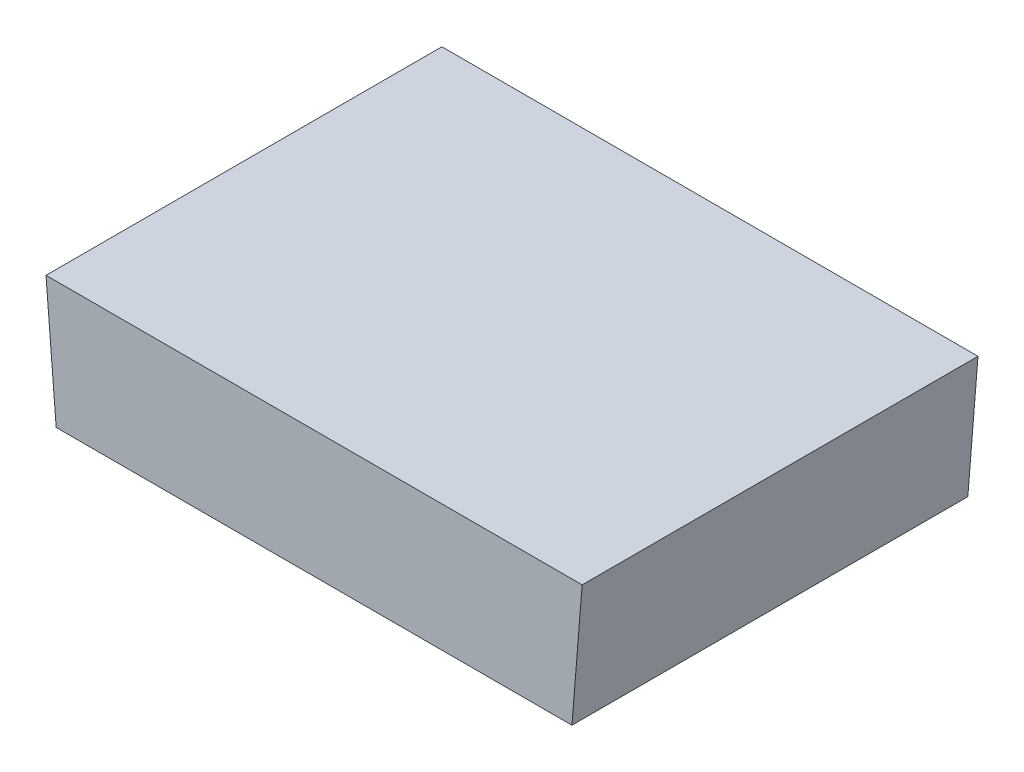
ISO-10303-21;
HEADER;
FILE_DESCRIPTION(('STEP AP214'),'2;1');
FILE_NAME('part.step','',(''),(''),'','','');
FILE_SCHEMA(('AUTOMOTIVE_DESIGN { 1 0 10303 214 1 1 1 1 }'));
ENDSEC;
DATA;
#1=APPLICATION_CONTEXT('core data for automotive mechanical design processes');
#2=APPLICATION_PROTOCOL_DEFINITION('international standard','automotive_design',2000,#1);
#3=PRODUCT_CONTEXT('',#1,'mechanical');
#4=PRODUCT('Part','Part','',(#3));
#5=PRODUCT_RELATED_PRODUCT_CATEGORY('part','',(#4));
#6=PRODUCT_DEFINITION_FORMATION('','',#4);
#7=PRODUCT_DEFINITION_CONTEXT('part definition',#1,'design');
#8=PRODUCT_DEFINITION('design','',#6,#7);
#9=PRODUCT_DEFINITION_SHAPE('','',#8);
#10=(LENGTH_UNIT() NAMED_UNIT(*) SI_UNIT(.MILLI.,.METRE.));
#11=(NAMED_UNIT(*) PLANE_ANGLE_UNIT() SI_UNIT($,.RADIAN.));
#12=(NAMED_UNIT(*) SI_UNIT($,.STERADIAN.) SOLID_ANGLE_UNIT());
#13=UNCERTAINTY_MEASURE_WITH_UNIT(LENGTH_MEASURE(1.E-05),#10,'distance_accuracy_value','');
#14=(GEOMETRIC_REPRESENTATION_CONTEXT(3) GLOBAL_UNCERTAINTY_ASSIGNED_CONTEXT((#13)) GLOBAL_UNIT_ASSIGNED_CONTEXT((#10,
#11,#12)) REPRESENTATION_CONTEXT('',''));
#15=CARTESIAN_POINT('',(0.,0.,0.));
#16=DIRECTION('',(0.,0.,1.));
#17=DIRECTION('',(1.,0.,0.));
#18=AXIS2_PLACEMENT_3D('',#15,#16,#17);
#19=CARTESIAN_POINT('',(45.24375,-11.9889788732394,69.453125));
#20=DIRECTION('',(0.,-1.,0.));
#21=DIRECTION('',(1.,0.,0.));
#22=AXIS2_PLACEMENT_3D('',#19,#20,#21);
#23=PLANE('',#22);
#24=CARTESIAN_POINT('',(36.01640625,-11.9889788732394,58.44778125));
#25=DIRECTION('',(0.,-1.,0.));
#26=DIRECTION('',(1.,0.,0.));
#27=AXIS2_PLACEMENT_3D('',#24,#25,#26);
#28=CIRCLE('',#27,6.05234374999999);
#29=CARTESIAN_POINT('',(42.06875,-11.9889788732394,58.44778125));
#30=VERTEX_POINT('',#29);
#31=EDGE_CURVE('E179',#30,#30,#28,.T.);
#32=ORIENTED_EDGE('',*,*,#31,.F.);
#33=EDGE_LOOP('',(#32));
#34=FACE_BOUND('',#33,.T.);
#35=CARTESIAN_POINT('',(-36.01640625,-11.9889788732394,57.24921875));
#36=DIRECTION('',(0.,-1.,0.));
#37=DIRECTION('',(1.,0.,0.));
#38=AXIS2_PLACEMENT_3D('',#35,#36,#37);
#39=CIRCLE('',#38,6.05234374999999);
#40=CARTESIAN_POINT('',(-29.9640625,-11.9889788732394,57.24921875));
#41=VERTEX_POINT('',#40);
#42=EDGE_CURVE('E183',#41,#41,#39,.T.);
#43=ORIENTED_EDGE('',*,*,#42,.F.);
#44=EDGE_LOOP('',(#43));
#45=FACE_BOUND('',#44,.T.);
#46=CARTESIAN_POINT('',(-36.01640625,-11.9889788732394,9.22734375));
#47=DIRECTION('',(0.,-1.,0.));
#48=DIRECTION('',(1.,0.,0.));
#49=AXIS2_PLACEMENT_3D('',#46,#47,#48);
#50=CIRCLE('',#49,6.05234375);
#51=CARTESIAN_POINT('',(-29.9640625,-11.9889788732394,9.22734375));
#52=VERTEX_POINT('',#51);
#53=EDGE_CURVE('E189',#52,#52,#50,.T.);
#54=ORIENTED_EDGE('',*,*,#53,.F.);
#55=EDGE_LOOP('',(#54));
#56=FACE_BOUND('',#55,.T.);
#57=CARTESIAN_POINT('',(36.01640625,-11.9889788732394,10.42590625));
#58=DIRECTION('',(0.,-1.,0.));
#59=DIRECTION('',(1.,0.,0.));
#60=AXIS2_PLACEMENT_3D('',#57,#58,#59);
#61=CIRCLE('',#60,6.05234375);
#62=CARTESIAN_POINT('',(42.06875,-11.9889788732394,10.42590625));
#63=VERTEX_POINT('',#62);
#64=EDGE_CURVE('E195',#63,#63,#61,.T.);
#65=ORIENTED_EDGE('',*,*,#64,.F.);
#66=EDGE_LOOP('',(#65));
#67=FACE_BOUND('',#66,.T.);
#68=DIRECTION('',(-1.,0.,0.));
#69=VECTOR('',#68,1.);
#70=CARTESIAN_POINT('',(45.24375,-11.9889788732394,0.));
#71=LINE('',#70,#69);
#72=CARTESIAN_POINT('',(45.24375,-11.9889788732394,0.));
#73=VERTEX_POINT('',#72);
#74=CARTESIAN_POINT('',(-45.24375,-11.9889788732394,0.));
#75=VERTEX_POINT('',#74);
#76=EDGE_CURVE('E208',#73,#75,#71,.T.);
#77=ORIENTED_EDGE('',*,*,#76,.F.);
#78=DIRECTION('',(0.,0.,-1.));
#79=VECTOR('',#78,1.);
#80=CARTESIAN_POINT('',(45.24375,-11.9889788732394,69.453125));
#81=LINE('',#80,#79);
#82=CARTESIAN_POINT('',(45.24375,-11.9889788732394,69.453125));
#83=VERTEX_POINT('',#82);
#84=EDGE_CURVE('E215',#83,#73,#81,.T.);
#85=ORIENTED_EDGE('',*,*,#84,.F.);
#86=DIRECTION('',(-1.,0.,0.));
#87=VECTOR('',#86,1.);
#88=CARTESIAN_POINT('',(45.24375,-11.9889788732394,69.453125));
#89=LINE('',#88,#87);
#90=CARTESIAN_POINT('',(-45.24375,-11.9889788732394,69.453125));
#91=VERTEX_POINT('',#90);
#92=EDGE_CURVE('E212',#83,#91,#89,.T.);
#93=ORIENTED_EDGE('',*,*,#92,.T.);
#94=DIRECTION('',(0.,0.,-1.));
#95=VECTOR('',#94,1.);
#96=CARTESIAN_POINT('',(-45.24375,-11.9889788732394,69.453125));
#97=LINE('',#96,#95);
#98=EDGE_CURVE('E226',#91,#75,#97,.T.);
#99=ORIENTED_EDGE('',*,*,#98,.T.);
#100=EDGE_LOOP('',(#77,#85,#93,#99));
#101=FACE_BOUND('',#100,.T.);
#102=DIRECTION('',(0.,0.,1.));
#103=VECTOR('',#102,1.);
#104=CARTESIAN_POINT('',(34.4110584654185,-11.9889788732394,33.4206221840761));
#105=LINE('',#104,#103);
#106=CARTESIAN_POINT('',(34.4110584654185,-11.9889788732394,33.4206221840761));
#107=VERTEX_POINT('',#106);
#108=CARTESIAN_POINT('',(34.4110584654185,-11.9889788732394,38.778434684076));
#109=VERTEX_POINT('',#108);
#110=EDGE_CURVE('E151',#107,#109,#105,.T.);
#111=ORIENTED_EDGE('',*,*,#110,.F.);
#112=CARTESIAN_POINT('',(29.1524647154185,-11.9889788732394,33.4206221840761));
#113=DIRECTION('',(0.,-1.,0.));
#114=DIRECTION('',(1.,0.,0.));
#115=AXIS2_PLACEMENT_3D('',#112,#113,#114);
#116=CIRCLE('',#115,5.25859375);
#117=CARTESIAN_POINT('',(23.8938709654185,-11.9889788732394,33.4206221840761));
#118=VERTEX_POINT('',#117);
#119=EDGE_CURVE('E148',#118,#107,#116,.T.);
#120=ORIENTED_EDGE('',*,*,#119,.F.);
#121=DIRECTION('',(0.,0.,-1.));
#122=VECTOR('',#121,1.);
#123=CARTESIAN_POINT('',(23.8938709654185,-11.9889788732394,33.4206221840761));
#124=LINE('',#123,#122);
#125=CARTESIAN_POINT('',(23.8938709654186,-11.9889788732394,38.778434684076));
#126=VERTEX_POINT('',#125);
#127=EDGE_CURVE('E160',#126,#118,#124,.T.);
#128=ORIENTED_EDGE('',*,*,#127,.F.);
#129=CARTESIAN_POINT('',(29.1524647154185,-11.9889788732394,38.778434684076));
#130=DIRECTION('',(0.,-1.,0.));
#131=DIRECTION('',(1.,0.,0.));
#132=AXIS2_PLACEMENT_3D('',#129,#130,#131);
#133=CIRCLE('',#132,5.25859375);
#134=EDGE_CURVE('E168',#109,#126,#133,.T.);
#135=ORIENTED_EDGE('',*,*,#134,.F.);
#136=EDGE_LOOP('',(#111,#120,#128,#135));
#137=FACE_BOUND('',#136,.T.);
#138=DIRECTION('',(0.,0.,1.));
#139=VECTOR('',#138,1.);
#140=CARTESIAN_POINT('',(-22.6633701564315,-11.9889788732394,32.4532589870959));
#141=LINE('',#140,#139);
#142=CARTESIAN_POINT('',(-22.6633701564315,-11.9889788732394,32.4532589870959));
#143=VERTEX_POINT('',#142);
#144=CARTESIAN_POINT('',(-22.6633701564315,-11.9889788732394,37.811071487096));
#145=VERTEX_POINT('',#144);
#146=EDGE_CURVE('E476',#143,#145,#141,.T.);
#147=ORIENTED_EDGE('',*,*,#146,.F.);
#148=CARTESIAN_POINT('',(-27.9219639064315,-11.9889788732394,32.4532589870959));
#149=DIRECTION('',(0.,-1.,0.));
#150=DIRECTION('',(1.,0.,0.));
#151=AXIS2_PLACEMENT_3D('',#148,#149,#150);
#152=CIRCLE('',#151,5.25859375);
#153=CARTESIAN_POINT('',(-33.1805576564315,-11.9889788732394,32.4532589870959));
#154=VERTEX_POINT('',#153);
#155=EDGE_CURVE('E146',#154,#143,#152,.T.);
#156=ORIENTED_EDGE('',*,*,#155,.F.);
#157=DIRECTION('',(0.,0.,-1.));
#158=VECTOR('',#157,1.);
#159=CARTESIAN_POINT('',(-33.1805576564315,-11.9889788732394,32.4532589870959));
#160=LINE('',#159,#158);
#161=CARTESIAN_POINT('',(-33.1805576564315,-11.9889788732394,37.811071487096));
#162=VERTEX_POINT('',#161);
#163=EDGE_CURVE('E142',#162,#154,#160,.T.);
#164=ORIENTED_EDGE('',*,*,#163,.F.);
#165=CARTESIAN_POINT('',(-27.9219639064315,-11.9889788732394,37.811071487096));
#166=DIRECTION('',(0.,-1.,0.));
#167=DIRECTION('',(1.,0.,0.));
#168=AXIS2_PLACEMENT_3D('',#165,#166,#167);
#169=CIRCLE('',#168,5.25859375);
#170=EDGE_CURVE('E473',#145,#162,#169,.T.);
#171=ORIENTED_EDGE('',*,*,#170,.F.);
#172=EDGE_LOOP('',(#147,#156,#164,#171));
#173=FACE_BOUND('',#172,.T.);
#174=ADVANCED_FACE('F33',(#34,#45,#56,#67,#101,#137,#173),#23,.T.);
#175=CARTESIAN_POINT('',(45.24375,-11.9889788732394,69.453125));
#176=DIRECTION('',(-0.996786917257566,0.0800989487081973,0.));
#177=DIRECTION('',(-0.0800989487081973,-0.996786917257566,0.));
#178=AXIS2_PLACEMENT_3D('',#175,#176,#177);
#179=PLANE('',#178);
#180=DIRECTION('',(0.0800989487081973,0.996786917257566,0.));
#181=VECTOR('',#180,1.);
#182=CARTESIAN_POINT('',(45.24375,-11.9889788732394,0.));
#183=LINE('',#182,#181);
#184=CARTESIAN_POINT('',(47.0296875,10.2360211267606,0.));
#185=VERTEX_POINT('',#184);
#186=EDGE_CURVE('E201',#73,#185,#183,.T.);
#187=ORIENTED_EDGE('',*,*,#186,.T.);
#188=DIRECTION('',(0.,0.,-1.));
#189=VECTOR('',#188,1.);
#190=CARTESIAN_POINT('',(47.0296875,10.2360211267606,69.453125));
#191=LINE('',#190,#189);
#192=CARTESIAN_POINT('',(47.0296875,10.2360211267606,69.453125));
#193=VERTEX_POINT('',#192);
#194=EDGE_CURVE('E11',#193,#185,#191,.T.);
#195=ORIENTED_EDGE('',*,*,#194,.F.);
#196=DIRECTION('',(0.0800989487081973,0.996786917257566,0.));
#197=VECTOR('',#196,1.);
#198=CARTESIAN_POINT('',(45.24375,-11.9889788732394,69.453125));
#199=LINE('',#198,#197);
#200=EDGE_CURVE('E204',#83,#193,#199,.T.);
#201=ORIENTED_EDGE('',*,*,#200,.F.);
#202=ORIENTED_EDGE('',*,*,#84,.T.);
#203=EDGE_LOOP('',(#187,#195,#201,#202));
#204=FACE_BOUND('',#203,.T.);
#205=ADVANCED_FACE('F35',(#204),#179,.F.);
#206=CARTESIAN_POINT('',(47.0296875,10.2360211267606,69.453125));
#207=DIRECTION('',(0.,-1.,0.));
#208=DIRECTION('',(1.,0.,0.));
#209=AXIS2_PLACEMENT_3D('',#206,#207,#208);
#210=PLANE('',#209);
#211=DIRECTION('',(-1.,0.,0.));
#212=VECTOR('',#211,1.);
#213=CARTESIAN_POINT('',(47.0296875,10.2360211267606,0.));
#214=LINE('',#213,#212);
#215=CARTESIAN_POINT('',(-47.0296875,10.2360211267606,0.));
#216=VERTEX_POINT('',#215);
#217=EDGE_CURVE('E218',#185,#216,#214,.T.);
#218=ORIENTED_EDGE('',*,*,#217,.T.);
#219=DIRECTION('',(0.,0.,-1.));
#220=VECTOR('',#219,1.);
#221=CARTESIAN_POINT('',(-47.0296875,10.2360211267606,69.453125));
#222=LINE('',#221,#220);
#223=CARTESIAN_POINT('',(-47.0296875,10.2360211267606,69.453125));
#224=VERTEX_POINT('',#223);
#225=EDGE_CURVE('E41',#224,#216,#222,.T.);
#226=ORIENTED_EDGE('',*,*,#225,.F.);
#227=DIRECTION('',(-1.,0.,0.));
#228=VECTOR('',#227,1.);
#229=CARTESIAN_POINT('',(47.0296875,10.2360211267606,69.453125));
#230=LINE('',#229,#228);
#231=EDGE_CURVE('E207',#193,#224,#230,.T.);
#232=ORIENTED_EDGE('',*,*,#231,.F.);
#233=ORIENTED_EDGE('',*,*,#194,.T.);
#234=EDGE_LOOP('',(#218,#226,#232,#233));
#235=FACE_BOUND('',#234,.T.);
#236=ADVANCED_FACE('F246',(#235),#210,.F.);
#237=CARTESIAN_POINT('',(-47.0296875,10.2360211267606,69.453125));
#238=DIRECTION('',(0.996786917257566,0.0800989487081973,0.));
#239=DIRECTION('',(-0.0800989487081973,0.996786917257566,0.));
#240=AXIS2_PLACEMENT_3D('',#237,#238,#239);
#241=PLANE('',#240);
#242=DIRECTION('',(0.0800989487081973,-0.996786917257566,0.));
#243=VECTOR('',#242,1.);
#244=CARTESIAN_POINT('',(-47.0296875,10.2360211267606,0.));
#245=LINE('',#244,#243);
#246=EDGE_CURVE('E220',#216,#75,#245,.T.);
#247=ORIENTED_EDGE('',*,*,#246,.T.);
#248=ORIENTED_EDGE('',*,*,#98,.F.);
#249=DIRECTION('',(0.0800989487081973,-0.996786917257566,0.));
#250=VECTOR('',#249,1.);
#251=CARTESIAN_POINT('',(-47.0296875,10.2360211267606,69.453125));
#252=LINE('',#251,#250);
#253=EDGE_CURVE('E210',#224,#91,#252,.T.);
#254=ORIENTED_EDGE('',*,*,#253,.F.);
#255=ORIENTED_EDGE('',*,*,#225,.T.);
#256=EDGE_LOOP('',(#247,#248,#254,#255));
#257=FACE_BOUND('',#256,.T.);
#258=ADVANCED_FACE('F232',(#257),#241,.F.);
#259=CARTESIAN_POINT('',(0.,0.,69.453125));
#260=DIRECTION('',(0.,0.,1.));
#261=DIRECTION('',(1.,0.,0.));
#262=AXIS2_PLACEMENT_3D('',#259,#260,#261);
#263=PLANE('',#262);
#264=ORIENTED_EDGE('',*,*,#200,.T.);
#265=ORIENTED_EDGE('',*,*,#231,.T.);
#266=ORIENTED_EDGE('',*,*,#253,.T.);
#267=ORIENTED_EDGE('',*,*,#92,.F.);
#268=EDGE_LOOP('',(#264,#265,#266,#267));
#269=FACE_BOUND('',#268,.T.);
#270=ADVANCED_FACE('F244',(#269),#263,.T.);
#271=CARTESIAN_POINT('',(0.,0.,0.));
#272=DIRECTION('',(0.,0.,1.));
#273=DIRECTION('',(1.,0.,0.));
#274=AXIS2_PLACEMENT_3D('',#271,#272,#273);
#275=PLANE('',#274);
#276=ORIENTED_EDGE('',*,*,#186,.F.);
#277=ORIENTED_EDGE('',*,*,#76,.T.);
#278=ORIENTED_EDGE('',*,*,#246,.F.);
#279=ORIENTED_EDGE('',*,*,#217,.F.);
#280=EDGE_LOOP('',(#276,#277,#278,#279));
#281=FACE_BOUND('',#280,.T.);
#282=ADVANCED_FACE('F237',(#281),#275,.F.);
#283=CARTESIAN_POINT('',(36.01640625,-15.1639788732394,10.42590625));
#284=DIRECTION('',(0.,1.,0.));
#285=DIRECTION('',(-1.,0.,0.));
#286=AXIS2_PLACEMENT_3D('',#283,#284,#285);
#287=CYLINDRICAL_SURFACE('',#286,6.05234375);
#288=CARTESIAN_POINT('',(36.01640625,-15.1639788732394,10.42590625));
#289=DIRECTION('',(0.,-1.,0.));
#290=DIRECTION('',(1.,0.,0.));
#291=AXIS2_PLACEMENT_3D('',#288,#289,#290);
#292=CIRCLE('',#291,6.05234375);
#293=CARTESIAN_POINT('',(42.06875,-15.1639788732394,10.42590625));
#294=VERTEX_POINT('',#293);
#295=EDGE_CURVE('E198',#294,#294,#292,.T.);
#296=ORIENTED_EDGE('',*,*,#295,.F.);
#297=EDGE_LOOP('',(#296));
#298=FACE_BOUND('',#297,.T.);
#299=ORIENTED_EDGE('',*,*,#64,.T.);
#300=EDGE_LOOP('',(#299));
#301=FACE_BOUND('',#300,.T.);
#302=ADVANCED_FACE('F269',(#298,#301),#287,.T.);
#303=CARTESIAN_POINT('',(36.01640625,-15.1639788732394,10.42590625));
#304=DIRECTION('',(0.,-1.,0.));
#305=DIRECTION('',(1.,0.,0.));
#306=AXIS2_PLACEMENT_3D('',#303,#304,#305);
#307=PLANE('',#306);
#308=ORIENTED_EDGE('',*,*,#295,.T.);
#309=EDGE_LOOP('',(#308));
#310=FACE_BOUND('',#309,.T.);
#311=ADVANCED_FACE('F273',(#310),#307,.T.);
#312=CARTESIAN_POINT('',(-36.01640625,-15.1639788732394,9.22734375));
#313=DIRECTION('',(0.,1.,0.));
#314=DIRECTION('',(-1.,0.,0.));
#315=AXIS2_PLACEMENT_3D('',#312,#313,#314);
#316=CYLINDRICAL_SURFACE('',#315,6.05234375);
#317=CARTESIAN_POINT('',(-36.01640625,-15.1639788732394,9.22734375));
#318=DIRECTION('',(0.,-1.,0.));
#319=DIRECTION('',(1.,0.,0.));
#320=AXIS2_PLACEMENT_3D('',#317,#318,#319);
#321=CIRCLE('',#320,6.05234375);
#322=CARTESIAN_POINT('',(-29.9640625,-15.1639788732394,9.22734375));
#323=VERTEX_POINT('',#322);
#324=EDGE_CURVE('E192',#323,#323,#321,.T.);
#325=ORIENTED_EDGE('',*,*,#324,.F.);
#326=EDGE_LOOP('',(#325));
#327=FACE_BOUND('',#326,.T.);
#328=ORIENTED_EDGE('',*,*,#53,.T.);
#329=EDGE_LOOP('',(#328));
#330=FACE_BOUND('',#329,.T.);
#331=ADVANCED_FACE('F277',(#327,#330),#316,.T.);
#332=CARTESIAN_POINT('',(-36.01640625,-15.1639788732394,9.22734375));
#333=DIRECTION('',(0.,-1.,0.));
#334=DIRECTION('',(1.,0.,0.));
#335=AXIS2_PLACEMENT_3D('',#332,#333,#334);
#336=PLANE('',#335);
#337=ORIENTED_EDGE('',*,*,#324,.T.);
#338=EDGE_LOOP('',(#337));
#339=FACE_BOUND('',#338,.T.);
#340=ADVANCED_FACE('F281',(#339),#336,.T.);
#341=CARTESIAN_POINT('',(-36.01640625,-15.1639788732394,57.24921875));
#342=DIRECTION('',(0.,1.,0.));
#343=DIRECTION('',(-1.,0.,0.));
#344=AXIS2_PLACEMENT_3D('',#341,#342,#343);
#345=CYLINDRICAL_SURFACE('',#344,6.05234374999999);
#346=CARTESIAN_POINT('',(-36.01640625,-15.1639788732394,57.24921875));
#347=DIRECTION('',(0.,-1.,0.));
#348=DIRECTION('',(1.,0.,0.));
#349=AXIS2_PLACEMENT_3D('',#346,#347,#348);
#350=CIRCLE('',#349,6.05234374999999);
#351=CARTESIAN_POINT('',(-29.9640625,-15.1639788732394,57.24921875));
#352=VERTEX_POINT('',#351);
#353=EDGE_CURVE('E186',#352,#352,#350,.T.);
#354=ORIENTED_EDGE('',*,*,#353,.F.);
#355=EDGE_LOOP('',(#354));
#356=FACE_BOUND('',#355,.T.);
#357=ORIENTED_EDGE('',*,*,#42,.T.);
#358=EDGE_LOOP('',(#357));
#359=FACE_BOUND('',#358,.T.);
#360=ADVANCED_FACE('F285',(#356,#359),#345,.T.);
#361=CARTESIAN_POINT('',(-36.01640625,-15.1639788732394,57.24921875));
#362=DIRECTION('',(0.,-1.,0.));
#363=DIRECTION('',(1.,0.,0.));
#364=AXIS2_PLACEMENT_3D('',#361,#362,#363);
#365=PLANE('',#364);
#366=ORIENTED_EDGE('',*,*,#353,.T.);
#367=EDGE_LOOP('',(#366));
#368=FACE_BOUND('',#367,.T.);
#369=ADVANCED_FACE('F289',(#368),#365,.T.);
#370=CARTESIAN_POINT('',(36.01640625,-15.1639788732394,58.44778125));
#371=DIRECTION('',(0.,1.,0.));
#372=DIRECTION('',(-1.,0.,0.));
#373=AXIS2_PLACEMENT_3D('',#370,#371,#372);
#374=CYLINDRICAL_SURFACE('',#373,6.05234374999999);
#375=CARTESIAN_POINT('',(36.01640625,-15.1639788732394,58.44778125));
#376=DIRECTION('',(0.,-1.,0.));
#377=DIRECTION('',(1.,0.,0.));
#378=AXIS2_PLACEMENT_3D('',#375,#376,#377);
#379=CIRCLE('',#378,6.05234374999999);
#380=CARTESIAN_POINT('',(42.06875,-15.1639788732394,58.44778125));
#381=VERTEX_POINT('',#380);
#382=EDGE_CURVE('E180',#381,#381,#379,.T.);
#383=ORIENTED_EDGE('',*,*,#382,.F.);
#384=EDGE_LOOP('',(#383));
#385=FACE_BOUND('',#384,.T.);
#386=ORIENTED_EDGE('',*,*,#31,.T.);
#387=EDGE_LOOP('',(#386));
#388=FACE_BOUND('',#387,.T.);
#389=ADVANCED_FACE('F293',(#385,#388),#374,.T.);
#390=CARTESIAN_POINT('',(36.01640625,-15.1639788732394,58.44778125));
#391=DIRECTION('',(0.,-1.,0.));
#392=DIRECTION('',(1.,0.,0.));
#393=AXIS2_PLACEMENT_3D('',#390,#391,#392);
#394=PLANE('',#393);
#395=ORIENTED_EDGE('',*,*,#382,.T.);
#396=EDGE_LOOP('',(#395));
#397=FACE_BOUND('',#396,.T.);
#398=ADVANCED_FACE('F297',(#397),#394,.T.);
#399=CARTESIAN_POINT('',(29.1524647154185,-15.1639788732394,33.4206221840761));
#400=DIRECTION('',(0.,1.,0.));
#401=DIRECTION('',(-1.,0.,0.));
#402=AXIS2_PLACEMENT_3D('',#399,#400,#401);
#403=CYLINDRICAL_SURFACE('',#402,5.25859375);
#404=ORIENTED_EDGE('',*,*,#119,.T.);
#405=DIRECTION('',(0.,1.,0.));
#406=VECTOR('',#405,1.);
#407=CARTESIAN_POINT('',(34.4110584654185,-15.1639788732394,33.4206221840761));
#408=LINE('',#407,#406);
#409=CARTESIAN_POINT('',(34.4110584654185,-15.1639788732394,33.4206221840761));
#410=VERTEX_POINT('',#409);
#411=EDGE_CURVE('E177',#410,#107,#408,.T.);
#412=ORIENTED_EDGE('',*,*,#411,.F.);
#413=CARTESIAN_POINT('',(29.1524647154185,-15.1639788732394,33.4206221840761));
#414=DIRECTION('',(0.,-1.,0.));
#415=DIRECTION('',(1.,0.,0.));
#416=AXIS2_PLACEMENT_3D('',#413,#414,#415);
#417=CIRCLE('',#416,5.25859375);
#418=CARTESIAN_POINT('',(23.8938709654185,-15.1639788732394,33.4206221840761));
#419=VERTEX_POINT('',#418);
#420=EDGE_CURVE('E156',#419,#410,#417,.T.);
#421=ORIENTED_EDGE('',*,*,#420,.F.);
#422=DIRECTION('',(0.,1.,0.));
#423=VECTOR('',#422,1.);
#424=CARTESIAN_POINT('',(23.8938709654185,-15.1639788732394,33.4206221840761));
#425=LINE('',#424,#423);
#426=EDGE_CURVE('E165',#419,#118,#425,.T.);
#427=ORIENTED_EDGE('',*,*,#426,.T.);
#428=EDGE_LOOP('',(#404,#412,#421,#427));
#429=FACE_BOUND('',#428,.T.);
#430=ADVANCED_FACE('F301',(#429),#403,.T.);
#431=CARTESIAN_POINT('',(34.4110584654185,-15.1639788732394,33.4206221840761));
#432=DIRECTION('',(-1.,0.,0.));
#433=DIRECTION('',(0.,-1.,0.));
#434=AXIS2_PLACEMENT_3D('',#431,#432,#433);
#435=PLANE('',#434);
#436=ORIENTED_EDGE('',*,*,#110,.T.);
#437=DIRECTION('',(0.,1.,0.));
#438=VECTOR('',#437,1.);
#439=CARTESIAN_POINT('',(34.4110584654185,-15.1639788732394,38.778434684076));
#440=LINE('',#439,#438);
#441=CARTESIAN_POINT('',(34.4110584654185,-15.1639788732394,38.778434684076));
#442=VERTEX_POINT('',#441);
#443=EDGE_CURVE('E174',#442,#109,#440,.T.);
#444=ORIENTED_EDGE('',*,*,#443,.F.);
#445=DIRECTION('',(0.,0.,1.));
#446=VECTOR('',#445,1.);
#447=CARTESIAN_POINT('',(34.4110584654185,-15.1639788732394,33.4206221840761));
#448=LINE('',#447,#446);
#449=EDGE_CURVE('E159',#410,#442,#448,.T.);
#450=ORIENTED_EDGE('',*,*,#449,.F.);
#451=ORIENTED_EDGE('',*,*,#411,.T.);
#452=EDGE_LOOP('',(#436,#444,#450,#451));
#453=FACE_BOUND('',#452,.T.);
#454=ADVANCED_FACE('F305',(#453),#435,.F.);
#455=CARTESIAN_POINT('',(29.1524647154185,-15.1639788732394,38.778434684076));
#456=DIRECTION('',(0.,1.,0.));
#457=DIRECTION('',(-1.,0.,0.));
#458=AXIS2_PLACEMENT_3D('',#455,#456,#457);
#459=CYLINDRICAL_SURFACE('',#458,5.25859375);
#460=ORIENTED_EDGE('',*,*,#134,.T.);
#461=DIRECTION('',(0.,1.,0.));
#462=VECTOR('',#461,1.);
#463=CARTESIAN_POINT('',(23.8938709654186,-15.1639788732394,38.778434684076));
#464=LINE('',#463,#462);
#465=CARTESIAN_POINT('',(23.8938709654186,-15.1639788732394,38.778434684076));
#466=VERTEX_POINT('',#465);
#467=EDGE_CURVE('E56',#466,#126,#464,.T.);
#468=ORIENTED_EDGE('',*,*,#467,.F.);
#469=CARTESIAN_POINT('',(29.1524647154185,-15.1639788732394,38.778434684076));
#470=DIRECTION('',(0.,-1.,0.));
#471=DIRECTION('',(1.,0.,0.));
#472=AXIS2_PLACEMENT_3D('',#469,#470,#471);
#473=CIRCLE('',#472,5.25859375);
#474=EDGE_CURVE('E162',#442,#466,#473,.T.);
#475=ORIENTED_EDGE('',*,*,#474,.F.);
#476=ORIENTED_EDGE('',*,*,#443,.T.);
#477=EDGE_LOOP('',(#460,#468,#475,#476));
#478=FACE_BOUND('',#477,.T.);
#479=ADVANCED_FACE('F309',(#478),#459,.T.);
#480=CARTESIAN_POINT('',(23.8938709654185,-15.1639788732394,33.4206221840761));
#481=DIRECTION('',(1.,0.,0.));
#482=DIRECTION('',(0.,0.,-1.));
#483=AXIS2_PLACEMENT_3D('',#480,#481,#482);
#484=PLANE('',#483);
#485=ORIENTED_EDGE('',*,*,#127,.T.);
#486=ORIENTED_EDGE('',*,*,#426,.F.);
#487=DIRECTION('',(0.,0.,-1.));
#488=VECTOR('',#487,1.);
#489=CARTESIAN_POINT('',(23.8938709654185,-15.1639788732394,33.4206221840761));
#490=LINE('',#489,#488);
#491=EDGE_CURVE('E164',#466,#419,#490,.T.);
#492=ORIENTED_EDGE('',*,*,#491,.F.);
#493=ORIENTED_EDGE('',*,*,#467,.T.);
#494=EDGE_LOOP('',(#485,#486,#492,#493));
#495=FACE_BOUND('',#494,.T.);
#496=ADVANCED_FACE('F313',(#495),#484,.F.);
#497=CARTESIAN_POINT('',(29.1524647154185,-15.1639788732394,33.4206221840761));
#498=DIRECTION('',(0.,-1.,0.));
#499=DIRECTION('',(1.,0.,0.));
#500=AXIS2_PLACEMENT_3D('',#497,#498,#499);
#501=PLANE('',#500);
#502=ORIENTED_EDGE('',*,*,#420,.T.);
#503=ORIENTED_EDGE('',*,*,#449,.T.);
#504=ORIENTED_EDGE('',*,*,#474,.T.);
#505=ORIENTED_EDGE('',*,*,#491,.T.);
#506=EDGE_LOOP('',(#502,#503,#504,#505));
#507=FACE_BOUND('',#506,.T.);
#508=ADVANCED_FACE('F317',(#507),#501,.T.);
#509=CARTESIAN_POINT('',(-27.9219639064315,-15.1639788732394,32.4532589870959));
#510=DIRECTION('',(0.,1.,0.));
#511=DIRECTION('',(-1.,0.,0.));
#512=AXIS2_PLACEMENT_3D('',#509,#510,#511);
#513=CYLINDRICAL_SURFACE('',#512,5.25859375);
#514=ORIENTED_EDGE('',*,*,#155,.T.);
#515=DIRECTION('',(0.,1.,0.));
#516=VECTOR('',#515,1.);
#517=CARTESIAN_POINT('',(-22.6633701564315,-15.1639788732394,32.4532589870959));
#518=LINE('',#517,#516);
#519=CARTESIAN_POINT('',(-22.6633701564315,-15.1639788732394,32.4532589870959));
#520=VERTEX_POINT('',#519);
#521=EDGE_CURVE('E127',#520,#143,#518,.T.);
#522=ORIENTED_EDGE('',*,*,#521,.F.);
#523=CARTESIAN_POINT('',(-27.9219639064315,-15.1639788732394,32.4532589870959));
#524=DIRECTION('',(0.,-1.,0.));
#525=DIRECTION('',(1.,0.,0.));
#526=AXIS2_PLACEMENT_3D('',#523,#524,#525);
#527=CIRCLE('',#526,5.25859375);
#528=CARTESIAN_POINT('',(-33.1805576564315,-15.1639788732394,32.4532589870959));
#529=VERTEX_POINT('',#528);
#530=EDGE_CURVE('E134',#529,#520,#527,.T.);
#531=ORIENTED_EDGE('',*,*,#530,.F.);
#532=DIRECTION('',(0.,1.,0.));
#533=VECTOR('',#532,1.);
#534=CARTESIAN_POINT('',(-33.1805576564315,-15.1639788732394,32.4532589870959));
#535=LINE('',#534,#533);
#536=EDGE_CURVE('E470',#529,#154,#535,.T.);
#537=ORIENTED_EDGE('',*,*,#536,.T.);
#538=EDGE_LOOP('',(#514,#522,#531,#537));
#539=FACE_BOUND('',#538,.T.);
#540=ADVANCED_FACE('F144',(#539),#513,.T.);
#541=CARTESIAN_POINT('',(-22.6633701564315,-15.1639788732394,32.4532589870959));
#542=DIRECTION('',(-1.,0.,0.));
#543=DIRECTION('',(0.,0.,1.));
#544=AXIS2_PLACEMENT_3D('',#541,#542,#543);
#545=PLANE('',#544);
#546=ORIENTED_EDGE('',*,*,#146,.T.);
#547=DIRECTION('',(0.,1.,0.));
#548=VECTOR('',#547,1.);
#549=CARTESIAN_POINT('',(-22.6633701564315,-15.1639788732394,37.811071487096));
#550=LINE('',#549,#548);
#551=CARTESIAN_POINT('',(-22.6633701564315,-15.1639788732394,37.811071487096));
#552=VERTEX_POINT('',#551);
#553=EDGE_CURVE('E130',#552,#145,#550,.T.);
#554=ORIENTED_EDGE('',*,*,#553,.F.);
#555=DIRECTION('',(0.,0.,1.));
#556=VECTOR('',#555,1.);
#557=CARTESIAN_POINT('',(-22.6633701564315,-15.1639788732394,32.4532589870959));
#558=LINE('',#557,#556);
#559=EDGE_CURVE('E123',#520,#552,#558,.T.);
#560=ORIENTED_EDGE('',*,*,#559,.F.);
#561=ORIENTED_EDGE('',*,*,#521,.T.);
#562=EDGE_LOOP('',(#546,#554,#560,#561));
#563=FACE_BOUND('',#562,.T.);
#564=ADVANCED_FACE('F125',(#563),#545,.F.);
#565=CARTESIAN_POINT('',(-27.9219639064315,-15.1639788732394,37.811071487096));
#566=DIRECTION('',(0.,1.,0.));
#567=DIRECTION('',(-1.,0.,0.));
#568=AXIS2_PLACEMENT_3D('',#565,#566,#567);
#569=CYLINDRICAL_SURFACE('',#568,5.25859375);
#570=ORIENTED_EDGE('',*,*,#170,.T.);
#571=DIRECTION('',(0.,1.,0.));
#572=VECTOR('',#571,1.);
#573=CARTESIAN_POINT('',(-33.1805576564315,-15.1639788732394,37.811071487096));
#574=LINE('',#573,#572);
#575=CARTESIAN_POINT('',(-33.1805576564315,-15.1639788732394,37.811071487096));
#576=VERTEX_POINT('',#575);
#577=EDGE_CURVE('E48',#576,#162,#574,.T.);
#578=ORIENTED_EDGE('',*,*,#577,.F.);
#579=CARTESIAN_POINT('',(-27.9219639064315,-15.1639788732394,37.811071487096));
#580=DIRECTION('',(0.,-1.,0.));
#581=DIRECTION('',(1.,0.,0.));
#582=AXIS2_PLACEMENT_3D('',#579,#580,#581);
#583=CIRCLE('',#582,5.25859375);
#584=EDGE_CURVE('E133',#552,#576,#583,.T.);
#585=ORIENTED_EDGE('',*,*,#584,.F.);
#586=ORIENTED_EDGE('',*,*,#553,.T.);
#587=EDGE_LOOP('',(#570,#578,#585,#586));
#588=FACE_BOUND('',#587,.T.);
#589=ADVANCED_FACE('F325',(#588),#569,.T.);
#590=CARTESIAN_POINT('',(-33.1805576564315,-15.1639788732394,32.4532589870959));
#591=DIRECTION('',(1.,0.,0.));
#592=DIRECTION('',(0.,1.,0.));
#593=AXIS2_PLACEMENT_3D('',#590,#591,#592);
#594=PLANE('',#593);
#595=ORIENTED_EDGE('',*,*,#163,.T.);
#596=ORIENTED_EDGE('',*,*,#536,.F.);
#597=DIRECTION('',(0.,0.,-1.));
#598=VECTOR('',#597,1.);
#599=CARTESIAN_POINT('',(-33.1805576564315,-15.1639788732394,32.4532589870959));
#600=LINE('',#599,#598);
#601=EDGE_CURVE('E138',#576,#529,#600,.T.);
#602=ORIENTED_EDGE('',*,*,#601,.F.);
#603=ORIENTED_EDGE('',*,*,#577,.T.);
#604=EDGE_LOOP('',(#595,#596,#602,#603));
#605=FACE_BOUND('',#604,.T.);
#606=ADVANCED_FACE('F328',(#605),#594,.F.);
#607=CARTESIAN_POINT('',(-27.9219639064315,-15.1639788732394,32.4532589870959));
#608=DIRECTION('',(0.,-1.,0.));
#609=DIRECTION('',(1.,0.,0.));
#610=AXIS2_PLACEMENT_3D('',#607,#608,#609);
#611=PLANE('',#610);
#612=ORIENTED_EDGE('',*,*,#530,.T.);
#613=ORIENTED_EDGE('',*,*,#559,.T.);
#614=ORIENTED_EDGE('',*,*,#584,.T.);
#615=ORIENTED_EDGE('',*,*,#601,.T.);
#616=EDGE_LOOP('',(#612,#613,#614,#615));
#617=FACE_BOUND('',#616,.T.);
#618=ADVANCED_FACE('F137',(#617),#611,.T.);
#619=CLOSED_SHELL('',(#174,#205,#236,#258,#270,#282,#302,#311,#331,#340,#360,#369,#389,#398,
#430,#454,#479,#496,#508,#540,#564,#589,#606,#618));
#620=MANIFOLD_SOLID_BREP('B2',#619);
#621=ADVANCED_BREP_SHAPE_REPRESENTATION('',(#18,#620),#14);
#622=SHAPE_DEFINITION_REPRESENTATION(#9,#621);
ENDSEC;
END-ISO-10303-21;
